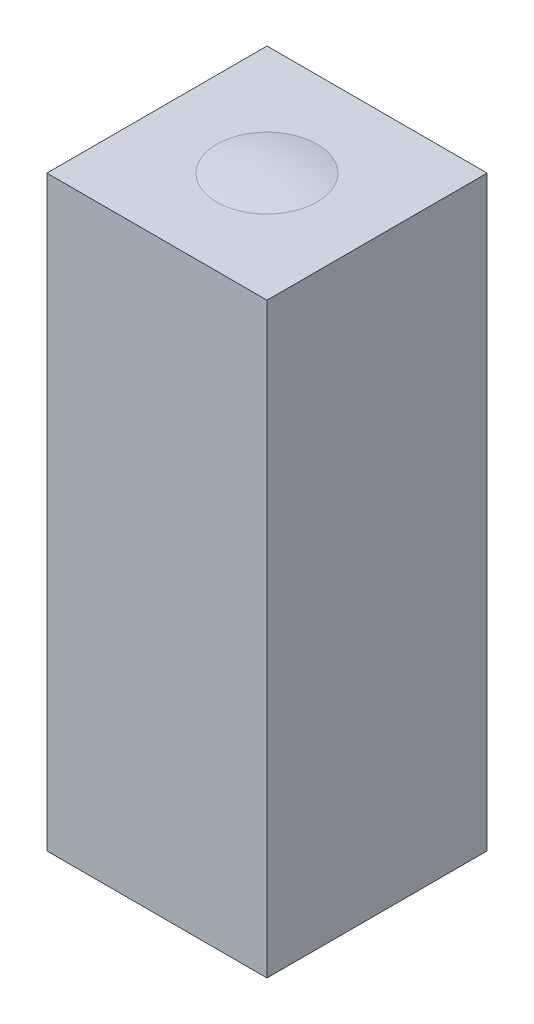
ISO-10303-21;
HEADER;
FILE_DESCRIPTION(('STEP AP214'),'2;1');
FILE_NAME('part.step','',(''),(''),'','','');
FILE_SCHEMA(('AUTOMOTIVE_DESIGN { 1 0 10303 214 1 1 1 1 }'));
ENDSEC;
DATA;
#1=APPLICATION_CONTEXT('core data for automotive mechanical design processes');
#2=APPLICATION_PROTOCOL_DEFINITION('international standard','automotive_design',2000,#1);
#3=PRODUCT_CONTEXT('',#1,'mechanical');
#4=PRODUCT('Part','Part','',(#3));
#5=PRODUCT_RELATED_PRODUCT_CATEGORY('part','',(#4));
#6=PRODUCT_DEFINITION_FORMATION('','',#4);
#7=PRODUCT_DEFINITION_CONTEXT('part definition',#1,'design');
#8=PRODUCT_DEFINITION('design','',#6,#7);
#9=PRODUCT_DEFINITION_SHAPE('','',#8);
#10=(LENGTH_UNIT() NAMED_UNIT(*) SI_UNIT(.MILLI.,.METRE.));
#11=(NAMED_UNIT(*) PLANE_ANGLE_UNIT() SI_UNIT($,.RADIAN.));
#12=(NAMED_UNIT(*) SI_UNIT($,.STERADIAN.) SOLID_ANGLE_UNIT());
#13=UNCERTAINTY_MEASURE_WITH_UNIT(LENGTH_MEASURE(1.E-05),#10,'distance_accuracy_value','');
#14=(GEOMETRIC_REPRESENTATION_CONTEXT(3) GLOBAL_UNCERTAINTY_ASSIGNED_CONTEXT((#13)) GLOBAL_UNIT_ASSIGNED_CONTEXT((#10,
#11,#12)) REPRESENTATION_CONTEXT('',''));
#15=CARTESIAN_POINT('',(0.,0.,0.));
#16=DIRECTION('',(0.,0.,1.));
#17=DIRECTION('',(1.,0.,0.));
#18=AXIS2_PLACEMENT_3D('',#15,#16,#17);
#19=CARTESIAN_POINT('',(-12.7118644067797,-80.,-17.1610169491525));
#20=DIRECTION('',(-1.,0.,0.));
#21=DIRECTION('',(0.,0.,1.));
#22=AXIS2_PLACEMENT_3D('',#19,#20,#21);
#23=PLANE('',#22);
#24=DIRECTION('',(0.,0.,1.));
#25=VECTOR('',#24,1.);
#26=CARTESIAN_POINT('',(-12.7118644067797,0.,-17.1610169491525));
#27=LINE('',#26,#25);
#28=CARTESIAN_POINT('',(-12.7118644067797,0.,-17.1610169491525));
#29=VERTEX_POINT('',#28);
#30=CARTESIAN_POINT('',(-12.7118644067797,0.,12.8389830508475));
#31=VERTEX_POINT('',#30);
#32=EDGE_CURVE('E98',#29,#31,#27,.T.);
#33=ORIENTED_EDGE('',*,*,#32,.T.);
#34=DIRECTION('',(0.,1.,0.));
#35=VECTOR('',#34,1.);
#36=CARTESIAN_POINT('',(-12.7118644067797,-80.,12.8389830508475));
#37=LINE('',#36,#35);
#38=CARTESIAN_POINT('',(-12.7118644067797,-80.,12.8389830508475));
#39=VERTEX_POINT('',#38);
#40=EDGE_CURVE('E11',#39,#31,#37,.T.);
#41=ORIENTED_EDGE('',*,*,#40,.F.);
#42=DIRECTION('',(0.,0.,1.));
#43=VECTOR('',#42,1.);
#44=CARTESIAN_POINT('',(-12.7118644067797,-80.,-17.1610169491525));
#45=LINE('',#44,#43);
#46=CARTESIAN_POINT('',(-12.7118644067797,-80.,-17.1610169491525));
#47=VERTEX_POINT('',#46);
#48=EDGE_CURVE('E84',#47,#39,#45,.T.);
#49=ORIENTED_EDGE('',*,*,#48,.F.);
#50=DIRECTION('',(0.,1.,0.));
#51=VECTOR('',#50,1.);
#52=CARTESIAN_POINT('',(-12.7118644067797,-80.,-17.1610169491525));
#53=LINE('',#52,#51);
#54=EDGE_CURVE('E51',#47,#29,#53,.T.);
#55=ORIENTED_EDGE('',*,*,#54,.T.);
#56=EDGE_LOOP('',(#33,#41,#49,#55));
#57=FACE_BOUND('',#56,.T.);
#58=ADVANCED_FACE('F35',(#57),#23,.F.);
#59=CARTESIAN_POINT('',(-12.7118644067797,-80.,12.8389830508475));
#60=DIRECTION('',(0.,0.,-1.));
#61=DIRECTION('',(-1.,0.,0.));
#62=AXIS2_PLACEMENT_3D('',#59,#60,#61);
#63=PLANE('',#62);
#64=DIRECTION('',(-1.,0.,0.));
#65=VECTOR('',#64,1.);
#66=CARTESIAN_POINT('',(-12.7118644067797,0.,12.8389830508475));
#67=LINE('',#66,#65);
#68=CARTESIAN_POINT('',(-42.7118644067797,0.,12.8389830508475));
#69=VERTEX_POINT('',#68);
#70=EDGE_CURVE('E89',#31,#69,#67,.T.);
#71=ORIENTED_EDGE('',*,*,#70,.T.);
#72=DIRECTION('',(0.,1.,0.));
#73=VECTOR('',#72,1.);
#74=CARTESIAN_POINT('',(-42.7118644067797,-80.,12.8389830508475));
#75=LINE('',#74,#73);
#76=CARTESIAN_POINT('',(-42.7118644067797,-80.,12.8389830508475));
#77=VERTEX_POINT('',#76);
#78=EDGE_CURVE('E43',#77,#69,#75,.T.);
#79=ORIENTED_EDGE('',*,*,#78,.F.);
#80=DIRECTION('',(-1.,0.,0.));
#81=VECTOR('',#80,1.);
#82=CARTESIAN_POINT('',(-12.7118644067797,-80.,12.8389830508475));
#83=LINE('',#82,#81);
#84=EDGE_CURVE('E76',#39,#77,#83,.T.);
#85=ORIENTED_EDGE('',*,*,#84,.F.);
#86=ORIENTED_EDGE('',*,*,#40,.T.);
#87=EDGE_LOOP('',(#71,#79,#85,#86));
#88=FACE_BOUND('',#87,.T.);
#89=ADVANCED_FACE('F88',(#88),#63,.F.);
#90=CARTESIAN_POINT('',(-42.7118644067797,-80.,-17.1610169491525));
#91=DIRECTION('',(-1.,0.,0.));
#92=DIRECTION('',(0.,0.,1.));
#93=AXIS2_PLACEMENT_3D('',#90,#91,#92);
#94=PLANE('',#93);
#95=DIRECTION('',(0.,0.,1.));
#96=VECTOR('',#95,1.);
#97=CARTESIAN_POINT('',(-42.7118644067797,0.,-17.1610169491525));
#98=LINE('',#97,#96);
#99=CARTESIAN_POINT('',(-42.7118644067797,0.,-17.1610169491525));
#100=VERTEX_POINT('',#99);
#101=EDGE_CURVE('E102',#100,#69,#98,.T.);
#102=ORIENTED_EDGE('',*,*,#101,.F.);
#103=DIRECTION('',(0.,1.,0.));
#104=VECTOR('',#103,1.);
#105=CARTESIAN_POINT('',(-42.7118644067797,-80.,-17.1610169491525));
#106=LINE('',#105,#104);
#107=CARTESIAN_POINT('',(-42.7118644067797,-80.,-17.1610169491525));
#108=VERTEX_POINT('',#107);
#109=EDGE_CURVE('E65',#108,#100,#106,.T.);
#110=ORIENTED_EDGE('',*,*,#109,.F.);
#111=DIRECTION('',(0.,0.,1.));
#112=VECTOR('',#111,1.);
#113=CARTESIAN_POINT('',(-42.7118644067797,-80.,-17.1610169491525));
#114=LINE('',#113,#112);
#115=EDGE_CURVE('E83',#108,#77,#114,.T.);
#116=ORIENTED_EDGE('',*,*,#115,.T.);
#117=ORIENTED_EDGE('',*,*,#78,.T.);
#118=EDGE_LOOP('',(#102,#110,#116,#117));
#119=FACE_BOUND('',#118,.T.);
#120=ADVANCED_FACE('F92',(#119),#94,.T.);
#121=CARTESIAN_POINT('',(-12.7118644067797,-80.,-17.1610169491525));
#122=DIRECTION('',(0.,0.,-1.));
#123=DIRECTION('',(-1.,0.,0.));
#124=AXIS2_PLACEMENT_3D('',#121,#122,#123);
#125=PLANE('',#124);
#126=DIRECTION('',(-1.,0.,0.));
#127=VECTOR('',#126,1.);
#128=CARTESIAN_POINT('',(-12.7118644067797,0.,-17.1610169491525));
#129=LINE('',#128,#127);
#130=EDGE_CURVE('E104',#29,#100,#129,.T.);
#131=ORIENTED_EDGE('',*,*,#130,.F.);
#132=ORIENTED_EDGE('',*,*,#54,.F.);
#133=DIRECTION('',(-1.,0.,0.));
#134=VECTOR('',#133,1.);
#135=CARTESIAN_POINT('',(-12.7118644067797,-80.,-17.1610169491525));
#136=LINE('',#135,#134);
#137=EDGE_CURVE('E93',#47,#108,#136,.T.);
#138=ORIENTED_EDGE('',*,*,#137,.T.);
#139=ORIENTED_EDGE('',*,*,#109,.T.);
#140=EDGE_LOOP('',(#131,#132,#138,#139));
#141=FACE_BOUND('',#140,.T.);
#142=ADVANCED_FACE('F127',(#141),#125,.T.);
#143=CARTESIAN_POINT('',(0.,-80.,0.));
#144=DIRECTION('',(0.,-1.,0.));
#145=DIRECTION('',(0.,0.,-1.));
#146=AXIS2_PLACEMENT_3D('',#143,#144,#145);
#147=PLANE('',#146);
#148=ORIENTED_EDGE('',*,*,#48,.T.);
#149=ORIENTED_EDGE('',*,*,#84,.T.);
#150=ORIENTED_EDGE('',*,*,#115,.F.);
#151=ORIENTED_EDGE('',*,*,#137,.F.);
#152=EDGE_LOOP('',(#148,#149,#150,#151));
#153=FACE_BOUND('',#152,.T.);
#154=ADVANCED_FACE('F80',(#153),#147,.T.);
#155=CARTESIAN_POINT('',(0.,0.,0.));
#156=DIRECTION('',(0.,-1.,0.));
#157=DIRECTION('',(0.,0.,-1.));
#158=AXIS2_PLACEMENT_3D('',#155,#156,#157);
#159=PLANE('',#158);
#160=CARTESIAN_POINT('',(-27.7118644067797,0.,-2.16101694915254));
#161=DIRECTION('',(0.,-1.,0.));
#162=DIRECTION('',(0.,0.,-1.));
#163=AXIS2_PLACEMENT_3D('',#160,#161,#162);
#164=CIRCLE('',#163,6.83995561054655);
#165=CARTESIAN_POINT('',(-27.7118644067797,0.,-9.0009725596991));
#166=VERTEX_POINT('',#165);
#167=EDGE_CURVE('E100',#166,#166,#164,.T.);
#168=ORIENTED_EDGE('',*,*,#167,.T.);
#169=EDGE_LOOP('',(#168));
#170=FACE_BOUND('',#169,.T.);
#171=ORIENTED_EDGE('',*,*,#32,.F.);
#172=ORIENTED_EDGE('',*,*,#130,.T.);
#173=ORIENTED_EDGE('',*,*,#101,.T.);
#174=ORIENTED_EDGE('',*,*,#70,.F.);
#175=EDGE_LOOP('',(#171,#172,#173,#174));
#176=FACE_BOUND('',#175,.T.);
#177=ADVANCED_FACE('F113',(#170,#176),#159,.F.);
#178=CARTESIAN_POINT('',(-27.7118644067797,-30.9366074689437,-2.16101694915254));
#179=DIRECTION('',(0.,-1.,0.));
#180=DIRECTION('',(-1.,0.,0.));
#181=AXIS2_PLACEMENT_3D('',#178,#179,#180);
#182=SPHERICAL_SURFACE('',#181,31.6837288594911);
#183=ORIENTED_EDGE('',*,*,#167,.F.);
#184=EDGE_LOOP('',(#183));
#185=FACE_BOUND('',#184,.T.);
#186=ADVANCED_FACE('F115',(#185),#182,.T.);
#187=CLOSED_SHELL('',(#58,#89,#120,#142,#154,#177,#186));
#188=MANIFOLD_SOLID_BREP('B2',#187);
#189=ADVANCED_BREP_SHAPE_REPRESENTATION('',(#18,#188),#14);
#190=SHAPE_DEFINITION_REPRESENTATION(#9,#189);
ENDSEC;
END-ISO-10303-21;
